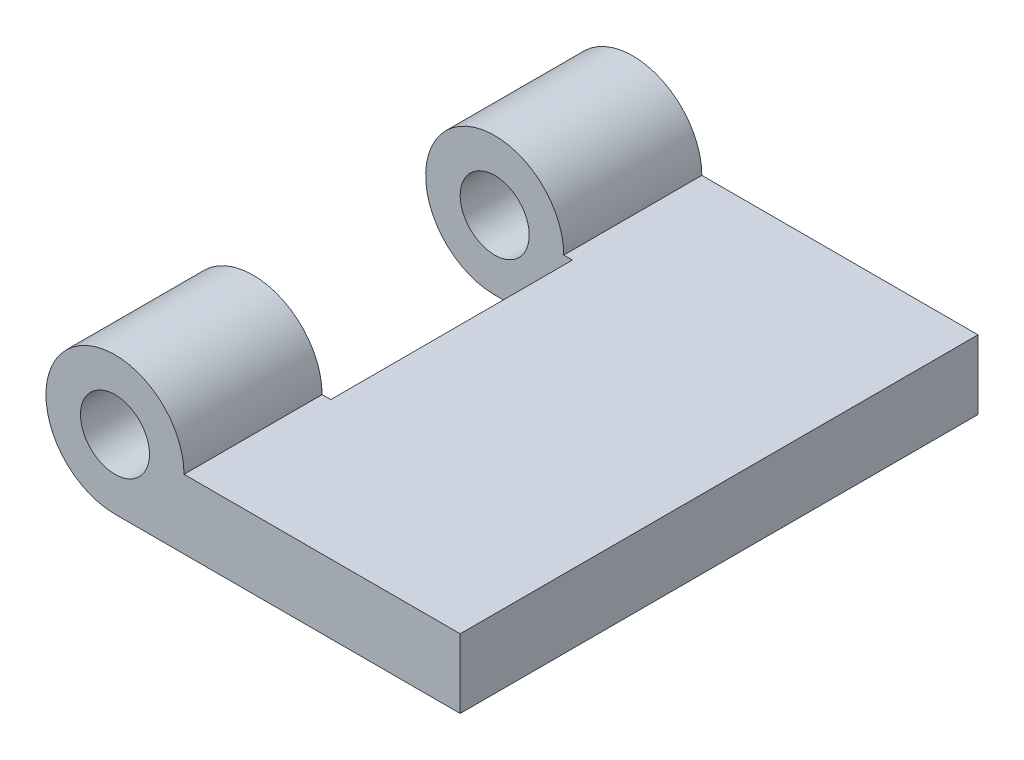
ISO-10303-21;
HEADER;
FILE_DESCRIPTION(('STEP AP214'),'2;1');
FILE_NAME('part.step','',(''),(''),'','','');
FILE_SCHEMA(('AUTOMOTIVE_DESIGN { 1 0 10303 214 1 1 1 1 }'));
ENDSEC;
DATA;
#1=APPLICATION_CONTEXT('core data for automotive mechanical design processes');
#2=APPLICATION_PROTOCOL_DEFINITION('international standard','automotive_design',2000,#1);
#3=PRODUCT_CONTEXT('',#1,'mechanical');
#4=PRODUCT('Part','Part','',(#3));
#5=PRODUCT_RELATED_PRODUCT_CATEGORY('part','',(#4));
#6=PRODUCT_DEFINITION_FORMATION('','',#4);
#7=PRODUCT_DEFINITION_CONTEXT('part definition',#1,'design');
#8=PRODUCT_DEFINITION('design','',#6,#7);
#9=PRODUCT_DEFINITION_SHAPE('','',#8);
#10=(LENGTH_UNIT() NAMED_UNIT(*) SI_UNIT(.MILLI.,.METRE.));
#11=(NAMED_UNIT(*) PLANE_ANGLE_UNIT() SI_UNIT($,.RADIAN.));
#12=(NAMED_UNIT(*) SI_UNIT($,.STERADIAN.) SOLID_ANGLE_UNIT());
#13=UNCERTAINTY_MEASURE_WITH_UNIT(LENGTH_MEASURE(1.E-05),#10,'distance_accuracy_value','');
#14=(GEOMETRIC_REPRESENTATION_CONTEXT(3) GLOBAL_UNCERTAINTY_ASSIGNED_CONTEXT((#13)) GLOBAL_UNIT_ASSIGNED_CONTEXT((#10,
#11,#12)) REPRESENTATION_CONTEXT('',''));
#15=CARTESIAN_POINT('',(0.,0.,0.));
#16=DIRECTION('',(0.,0.,1.));
#17=DIRECTION('',(1.,0.,0.));
#18=AXIS2_PLACEMENT_3D('',#15,#16,#17);
#19=CARTESIAN_POINT('',(0.,0.,30.));
#20=DIRECTION('',(0.,0.,-1.));
#21=DIRECTION('',(-1.,0.,0.));
#22=AXIS2_PLACEMENT_3D('',#19,#20,#21);
#23=CYLINDRICAL_SURFACE('',#22,4.);
#24=DIRECTION('',(0.,0.,-1.));
#25=VECTOR('',#24,1.);
#26=CARTESIAN_POINT('',(0.,-4.,30.));
#27=LINE('',#26,#25);
#28=CARTESIAN_POINT('',(0.,-4.,8.));
#29=VERTEX_POINT('',#28);
#30=CARTESIAN_POINT('',(0.,-4.,0.));
#31=VERTEX_POINT('',#30);
#32=EDGE_CURVE('E193',#29,#31,#27,.T.);
#33=ORIENTED_EDGE('',*,*,#32,.F.);
#34=CARTESIAN_POINT('',(0.,0.,8.));
#35=DIRECTION('',(0.,0.,-1.));
#36=DIRECTION('',(-1.,0.,0.));
#37=AXIS2_PLACEMENT_3D('',#34,#35,#36);
#38=CIRCLE('',#37,4.);
#39=CARTESIAN_POINT('',(4.,0.,8.));
#40=VERTEX_POINT('',#39);
#41=EDGE_CURVE('E133',#29,#40,#38,.T.);
#42=ORIENTED_EDGE('',*,*,#41,.T.);
#43=DIRECTION('',(0.,0.,-1.));
#44=VECTOR('',#43,1.);
#45=CARTESIAN_POINT('',(4.,0.,30.));
#46=LINE('',#45,#44);
#47=CARTESIAN_POINT('',(4.,0.,0.));
#48=VERTEX_POINT('',#47);
#49=EDGE_CURVE('E197',#40,#48,#46,.T.);
#50=ORIENTED_EDGE('',*,*,#49,.T.);
#51=CARTESIAN_POINT('',(0.,0.,0.));
#52=DIRECTION('',(0.,0.,1.));
#53=DIRECTION('',(1.,0.,0.));
#54=AXIS2_PLACEMENT_3D('',#51,#52,#53);
#55=CIRCLE('',#54,4.);
#56=EDGE_CURVE('E185',#48,#31,#55,.T.);
#57=ORIENTED_EDGE('',*,*,#56,.T.);
#58=EDGE_LOOP('',(#33,#42,#50,#57));
#59=FACE_BOUND('',#58,.T.);
#60=ADVANCED_FACE('F45',(#59),#23,.T.);
#61=CARTESIAN_POINT('',(20.,0.,30.));
#62=DIRECTION('',(-1.,0.,0.));
#63=DIRECTION('',(0.,0.,1.));
#64=AXIS2_PLACEMENT_3D('',#61,#62,#63);
#65=PLANE('',#64);
#66=DIRECTION('',(0.,1.,0.));
#67=VECTOR('',#66,1.);
#68=CARTESIAN_POINT('',(20.,0.,0.));
#69=LINE('',#68,#67);
#70=CARTESIAN_POINT('',(20.,-4.,0.));
#71=VERTEX_POINT('',#70);
#72=CARTESIAN_POINT('',(20.,0.,0.));
#73=VERTEX_POINT('',#72);
#74=EDGE_CURVE('E166',#71,#73,#69,.T.);
#75=ORIENTED_EDGE('',*,*,#74,.T.);
#76=DIRECTION('',(0.,0.,-1.));
#77=VECTOR('',#76,1.);
#78=CARTESIAN_POINT('',(20.,0.,30.));
#79=LINE('',#78,#77);
#80=CARTESIAN_POINT('',(20.,0.,30.));
#81=VERTEX_POINT('',#80);
#82=EDGE_CURVE('E55',#81,#73,#79,.T.);
#83=ORIENTED_EDGE('',*,*,#82,.F.);
#84=DIRECTION('',(0.,1.,0.));
#85=VECTOR('',#84,1.);
#86=CARTESIAN_POINT('',(20.,0.,30.));
#87=LINE('',#86,#85);
#88=CARTESIAN_POINT('',(20.,-4.,30.));
#89=VERTEX_POINT('',#88);
#90=EDGE_CURVE('E167',#89,#81,#87,.T.);
#91=ORIENTED_EDGE('',*,*,#90,.F.);
#92=DIRECTION('',(0.,0.,-1.));
#93=VECTOR('',#92,1.);
#94=CARTESIAN_POINT('',(20.,-4.,30.));
#95=LINE('',#94,#93);
#96=EDGE_CURVE('E177',#89,#71,#95,.T.);
#97=ORIENTED_EDGE('',*,*,#96,.T.);
#98=EDGE_LOOP('',(#75,#83,#91,#97));
#99=FACE_BOUND('',#98,.T.);
#100=ADVANCED_FACE('F47',(#99),#65,.F.);
#101=CARTESIAN_POINT('',(4.,0.,30.));
#102=DIRECTION('',(0.,-1.,0.));
#103=DIRECTION('',(0.,0.,-1.));
#104=AXIS2_PLACEMENT_3D('',#101,#102,#103);
#105=PLANE('',#104);
#106=ORIENTED_EDGE('',*,*,#49,.F.);
#107=DIRECTION('',(1.,0.,0.));
#108=VECTOR('',#107,1.);
#109=CARTESIAN_POINT('',(4.,0.,8.));
#110=LINE('',#109,#108);
#111=CARTESIAN_POINT('',(4.5,0.,8.));
#112=VERTEX_POINT('',#111);
#113=EDGE_CURVE('E161',#40,#112,#110,.T.);
#114=ORIENTED_EDGE('',*,*,#113,.T.);
#115=DIRECTION('',(0.,0.,1.));
#116=VECTOR('',#115,1.);
#117=CARTESIAN_POINT('',(4.5,0.,30.));
#118=LINE('',#117,#116);
#119=CARTESIAN_POINT('',(4.5,0.,22.));
#120=VERTEX_POINT('',#119);
#121=EDGE_CURVE('E124',#112,#120,#118,.T.);
#122=ORIENTED_EDGE('',*,*,#121,.T.);
#123=DIRECTION('',(-1.,0.,0.));
#124=VECTOR('',#123,1.);
#125=CARTESIAN_POINT('',(4.,0.,22.));
#126=LINE('',#125,#124);
#127=CARTESIAN_POINT('',(4.,0.,22.));
#128=VERTEX_POINT('',#127);
#129=EDGE_CURVE('E155',#120,#128,#126,.T.);
#130=ORIENTED_EDGE('',*,*,#129,.T.);
#131=CARTESIAN_POINT('',(4.,0.,30.));
#132=VERTEX_POINT('',#131);
#133=EDGE_CURVE('E198',#132,#128,#46,.T.);
#134=ORIENTED_EDGE('',*,*,#133,.F.);
#135=DIRECTION('',(-1.,0.,0.));
#136=VECTOR('',#135,1.);
#137=CARTESIAN_POINT('',(4.,0.,30.));
#138=LINE('',#137,#136);
#139=EDGE_CURVE('E99',#81,#132,#138,.T.);
#140=ORIENTED_EDGE('',*,*,#139,.F.);
#141=ORIENTED_EDGE('',*,*,#82,.T.);
#142=DIRECTION('',(-1.,0.,0.));
#143=VECTOR('',#142,1.);
#144=CARTESIAN_POINT('',(4.,0.,0.));
#145=LINE('',#144,#143);
#146=EDGE_CURVE('E181',#73,#48,#145,.T.);
#147=ORIENTED_EDGE('',*,*,#146,.T.);
#148=EDGE_LOOP('',(#106,#114,#122,#130,#134,#140,#141,#147));
#149=FACE_BOUND('',#148,.T.);
#150=ADVANCED_FACE('F205',(#149),#105,.F.);
#151=ORIENTED_EDGE('',*,*,#133,.T.);
#152=CARTESIAN_POINT('',(0.,0.,22.));
#153=DIRECTION('',(0.,0.,1.));
#154=DIRECTION('',(1.,0.,0.));
#155=AXIS2_PLACEMENT_3D('',#152,#153,#154);
#156=CIRCLE('',#155,4.);
#157=CARTESIAN_POINT('',(0.,-4.,22.));
#158=VERTEX_POINT('',#157);
#159=EDGE_CURVE('E128',#128,#158,#156,.T.);
#160=ORIENTED_EDGE('',*,*,#159,.T.);
#161=CARTESIAN_POINT('',(0.,-4.,30.));
#162=VERTEX_POINT('',#161);
#163=EDGE_CURVE('E194',#162,#158,#27,.T.);
#164=ORIENTED_EDGE('',*,*,#163,.F.);
#165=CARTESIAN_POINT('',(0.,0.,30.));
#166=DIRECTION('',(0.,0.,1.));
#167=DIRECTION('',(1.,0.,0.));
#168=AXIS2_PLACEMENT_3D('',#165,#166,#167);
#169=CIRCLE('',#168,4.);
#170=EDGE_CURVE('E172',#132,#162,#169,.T.);
#171=ORIENTED_EDGE('',*,*,#170,.F.);
#172=EDGE_LOOP('',(#151,#160,#164,#171));
#173=FACE_BOUND('',#172,.T.);
#174=ADVANCED_FACE('F218',(#173),#23,.T.);
#175=CARTESIAN_POINT('',(0.,-4.,30.));
#176=DIRECTION('',(0.,1.,0.));
#177=DIRECTION('',(0.,0.,1.));
#178=AXIS2_PLACEMENT_3D('',#175,#176,#177);
#179=PLANE('',#178);
#180=DIRECTION('',(0.,0.,1.));
#181=VECTOR('',#180,1.);
#182=CARTESIAN_POINT('',(4.5,-4.,8.));
#183=LINE('',#182,#181);
#184=CARTESIAN_POINT('',(4.5,-4.,8.));
#185=VERTEX_POINT('',#184);
#186=CARTESIAN_POINT('',(4.5,-4.,22.));
#187=VERTEX_POINT('',#186);
#188=EDGE_CURVE('E62',#185,#187,#183,.T.);
#189=ORIENTED_EDGE('',*,*,#188,.F.);
#190=DIRECTION('',(-1.,0.,0.));
#191=VECTOR('',#190,1.);
#192=CARTESIAN_POINT('',(0.,-4.,8.));
#193=LINE('',#192,#191);
#194=EDGE_CURVE('E11',#185,#29,#193,.T.);
#195=ORIENTED_EDGE('',*,*,#194,.T.);
#196=ORIENTED_EDGE('',*,*,#32,.T.);
#197=DIRECTION('',(1.,0.,0.));
#198=VECTOR('',#197,1.);
#199=CARTESIAN_POINT('',(0.,-4.,0.));
#200=LINE('',#199,#198);
#201=EDGE_CURVE('E91',#31,#71,#200,.T.);
#202=ORIENTED_EDGE('',*,*,#201,.T.);
#203=ORIENTED_EDGE('',*,*,#96,.F.);
#204=DIRECTION('',(1.,0.,0.));
#205=VECTOR('',#204,1.);
#206=CARTESIAN_POINT('',(0.,-4.,30.));
#207=LINE('',#206,#205);
#208=EDGE_CURVE('E71',#162,#89,#207,.T.);
#209=ORIENTED_EDGE('',*,*,#208,.F.);
#210=ORIENTED_EDGE('',*,*,#163,.T.);
#211=DIRECTION('',(-1.,0.,0.));
#212=VECTOR('',#211,1.);
#213=CARTESIAN_POINT('',(-4.5,-4.,22.));
#214=LINE('',#213,#212);
#215=EDGE_CURVE('E138',#187,#158,#214,.T.);
#216=ORIENTED_EDGE('',*,*,#215,.F.);
#217=EDGE_LOOP('',(#189,#195,#196,#202,#203,#209,#210,#216));
#218=FACE_BOUND('',#217,.T.);
#219=ADVANCED_FACE('F136',(#218),#179,.F.);
#220=CARTESIAN_POINT('',(0.,0.,30.));
#221=DIRECTION('',(0.,0.,1.));
#222=DIRECTION('',(1.,0.,0.));
#223=AXIS2_PLACEMENT_3D('',#220,#221,#222);
#224=PLANE('',#223);
#225=CARTESIAN_POINT('',(0.,0.,30.));
#226=DIRECTION('',(0.,0.,1.));
#227=DIRECTION('',(1.,0.,0.));
#228=AXIS2_PLACEMENT_3D('',#225,#226,#227);
#229=CIRCLE('',#228,2.);
#230=CARTESIAN_POINT('',(2.,0.,30.));
#231=VERTEX_POINT('',#230);
#232=EDGE_CURVE('E140',#231,#231,#229,.T.);
#233=ORIENTED_EDGE('',*,*,#232,.F.);
#234=EDGE_LOOP('',(#233));
#235=FACE_BOUND('',#234,.T.);
#236=ORIENTED_EDGE('',*,*,#90,.T.);
#237=ORIENTED_EDGE('',*,*,#139,.T.);
#238=ORIENTED_EDGE('',*,*,#170,.T.);
#239=ORIENTED_EDGE('',*,*,#208,.T.);
#240=EDGE_LOOP('',(#236,#237,#238,#239));
#241=FACE_BOUND('',#240,.T.);
#242=ADVANCED_FACE('F220',(#235,#241),#224,.T.);
#243=CARTESIAN_POINT('',(0.,0.,0.));
#244=DIRECTION('',(0.,0.,1.));
#245=DIRECTION('',(1.,0.,0.));
#246=AXIS2_PLACEMENT_3D('',#243,#244,#245);
#247=PLANE('',#246);
#248=CARTESIAN_POINT('',(0.,0.,0.));
#249=DIRECTION('',(0.,0.,-1.));
#250=DIRECTION('',(-1.,0.,0.));
#251=AXIS2_PLACEMENT_3D('',#248,#249,#250);
#252=CIRCLE('',#251,2.);
#253=CARTESIAN_POINT('',(-2.,0.,0.));
#254=VERTEX_POINT('',#253);
#255=EDGE_CURVE('E324',#254,#254,#252,.T.);
#256=ORIENTED_EDGE('',*,*,#255,.F.);
#257=EDGE_LOOP('',(#256));
#258=FACE_BOUND('',#257,.T.);
#259=ORIENTED_EDGE('',*,*,#74,.F.);
#260=ORIENTED_EDGE('',*,*,#201,.F.);
#261=ORIENTED_EDGE('',*,*,#56,.F.);
#262=ORIENTED_EDGE('',*,*,#146,.F.);
#263=EDGE_LOOP('',(#259,#260,#261,#262));
#264=FACE_BOUND('',#263,.T.);
#265=ADVANCED_FACE('F211',(#258,#264),#247,.F.);
#266=CARTESIAN_POINT('',(4.5,11.,8.));
#267=DIRECTION('',(1.,0.,0.));
#268=DIRECTION('',(0.,0.,-1.));
#269=AXIS2_PLACEMENT_3D('',#266,#267,#268);
#270=PLANE('',#269);
#271=DIRECTION('',(0.,-1.,0.));
#272=VECTOR('',#271,1.);
#273=CARTESIAN_POINT('',(4.5,11.,8.));
#274=LINE('',#273,#272);
#275=EDGE_CURVE('E120',#112,#185,#274,.T.);
#276=ORIENTED_EDGE('',*,*,#275,.T.);
#277=ORIENTED_EDGE('',*,*,#188,.T.);
#278=DIRECTION('',(0.,-1.,0.));
#279=VECTOR('',#278,1.);
#280=CARTESIAN_POINT('',(4.5,11.,22.));
#281=LINE('',#280,#279);
#282=EDGE_CURVE('E129',#120,#187,#281,.T.);
#283=ORIENTED_EDGE('',*,*,#282,.F.);
#284=ORIENTED_EDGE('',*,*,#121,.F.);
#285=EDGE_LOOP('',(#276,#277,#283,#284));
#286=FACE_BOUND('',#285,.T.);
#287=ADVANCED_FACE('F122',(#286),#270,.F.);
#288=CARTESIAN_POINT('',(-4.5,11.,8.));
#289=DIRECTION('',(0.,0.,-1.));
#290=DIRECTION('',(-1.,0.,0.));
#291=AXIS2_PLACEMENT_3D('',#288,#289,#290);
#292=PLANE('',#291);
#293=CARTESIAN_POINT('',(0.,0.,8.));
#294=DIRECTION('',(0.,0.,-1.));
#295=DIRECTION('',(-1.,0.,0.));
#296=AXIS2_PLACEMENT_3D('',#293,#294,#295);
#297=CIRCLE('',#296,2.);
#298=CARTESIAN_POINT('',(-2.,0.,8.));
#299=VERTEX_POINT('',#298);
#300=EDGE_CURVE('E146',#299,#299,#297,.T.);
#301=ORIENTED_EDGE('',*,*,#300,.T.);
#302=EDGE_LOOP('',(#301));
#303=FACE_BOUND('',#302,.T.);
#304=ORIENTED_EDGE('',*,*,#41,.F.);
#305=ORIENTED_EDGE('',*,*,#194,.F.);
#306=ORIENTED_EDGE('',*,*,#275,.F.);
#307=ORIENTED_EDGE('',*,*,#113,.F.);
#308=EDGE_LOOP('',(#304,#305,#306,#307));
#309=FACE_BOUND('',#308,.T.);
#310=ADVANCED_FACE('F131',(#303,#309),#292,.F.);
#311=CARTESIAN_POINT('',(-4.5,11.,22.));
#312=DIRECTION('',(0.,0.,1.));
#313=DIRECTION('',(1.,0.,0.));
#314=AXIS2_PLACEMENT_3D('',#311,#312,#313);
#315=PLANE('',#314);
#316=CARTESIAN_POINT('',(0.,0.,22.));
#317=DIRECTION('',(0.,0.,1.));
#318=DIRECTION('',(1.,0.,0.));
#319=AXIS2_PLACEMENT_3D('',#316,#317,#318);
#320=CIRCLE('',#319,2.);
#321=CARTESIAN_POINT('',(2.,0.,22.));
#322=VERTEX_POINT('',#321);
#323=EDGE_CURVE('E49',#322,#322,#320,.T.);
#324=ORIENTED_EDGE('',*,*,#323,.T.);
#325=EDGE_LOOP('',(#324));
#326=FACE_BOUND('',#325,.T.);
#327=ORIENTED_EDGE('',*,*,#282,.T.);
#328=ORIENTED_EDGE('',*,*,#215,.T.);
#329=ORIENTED_EDGE('',*,*,#159,.F.);
#330=ORIENTED_EDGE('',*,*,#129,.F.);
#331=EDGE_LOOP('',(#327,#328,#329,#330));
#332=FACE_BOUND('',#331,.T.);
#333=ADVANCED_FACE('F289',(#326,#332),#315,.F.);
#334=CARTESIAN_POINT('',(0.,0.,32.));
#335=DIRECTION('',(0.,0.,-1.));
#336=DIRECTION('',(-1.,0.,0.));
#337=AXIS2_PLACEMENT_3D('',#334,#335,#336);
#338=CYLINDRICAL_SURFACE('',#337,2.);
#339=ORIENTED_EDGE('',*,*,#232,.T.);
#340=EDGE_LOOP('',(#339));
#341=FACE_BOUND('',#340,.T.);
#342=ORIENTED_EDGE('',*,*,#323,.F.);
#343=EDGE_LOOP('',(#342));
#344=FACE_BOUND('',#343,.T.);
#345=ADVANCED_FACE('F299',(#341,#344),#338,.F.);
#346=ORIENTED_EDGE('',*,*,#255,.T.);
#347=EDGE_LOOP('',(#346));
#348=FACE_BOUND('',#347,.T.);
#349=ORIENTED_EDGE('',*,*,#300,.F.);
#350=EDGE_LOOP('',(#349));
#351=FACE_BOUND('',#350,.T.);
#352=ADVANCED_FACE('F309',(#348,#351),#338,.F.);
#353=CLOSED_SHELL('',(#60,#100,#150,#174,#219,#242,#265,#287,#310,#333,#345,#352));
#354=MANIFOLD_SOLID_BREP('B2',#353);
#355=ADVANCED_BREP_SHAPE_REPRESENTATION('',(#18,#354),#14);
#356=SHAPE_DEFINITION_REPRESENTATION(#9,#355);
ENDSEC;
END-ISO-10303-21;
